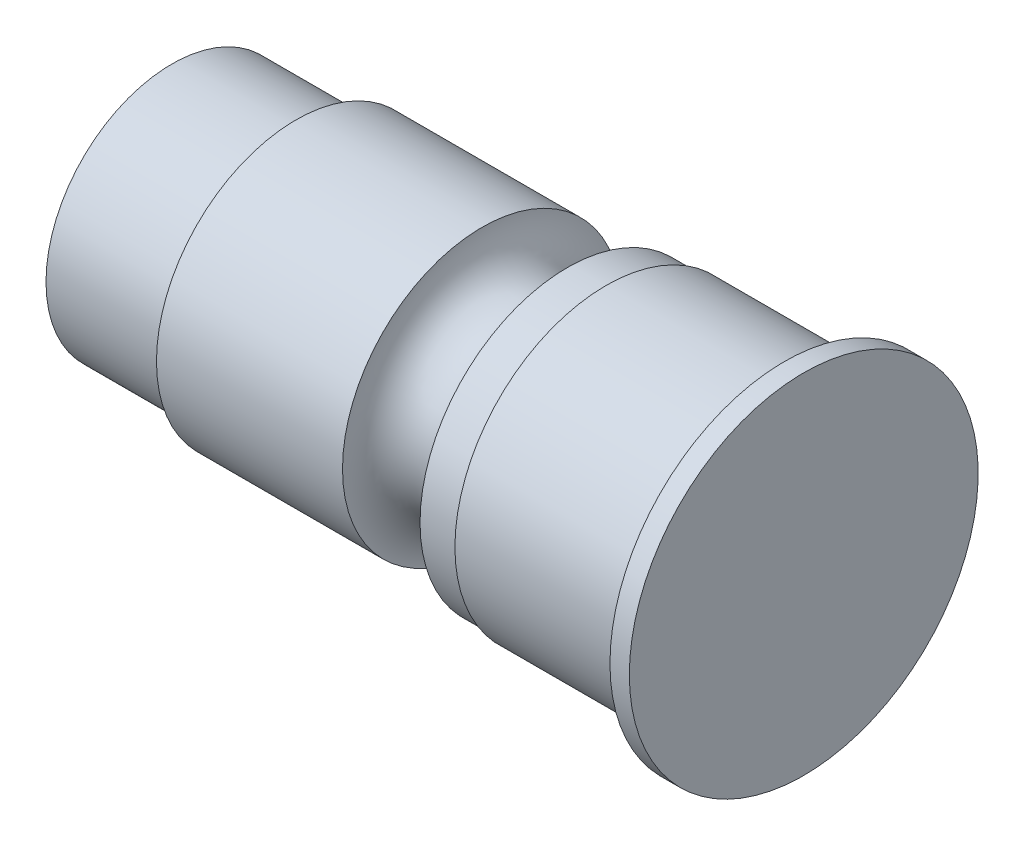
ISO-10303-21;
HEADER;
FILE_DESCRIPTION(('STEP AP214'),'2;1');
FILE_NAME('part.step','',(''),(''),'','','');
FILE_SCHEMA(('AUTOMOTIVE_DESIGN { 1 0 10303 214 1 1 1 1 }'));
ENDSEC;
DATA;
#1=APPLICATION_CONTEXT('core data for automotive mechanical design processes');
#2=APPLICATION_PROTOCOL_DEFINITION('international standard','automotive_design',2000,#1);
#3=PRODUCT_CONTEXT('',#1,'mechanical');
#4=PRODUCT('Part','Part','',(#3));
#5=PRODUCT_RELATED_PRODUCT_CATEGORY('part','',(#4));
#6=PRODUCT_DEFINITION_FORMATION('','',#4);
#7=PRODUCT_DEFINITION_CONTEXT('part definition',#1,'design');
#8=PRODUCT_DEFINITION('design','',#6,#7);
#9=PRODUCT_DEFINITION_SHAPE('','',#8);
#10=(LENGTH_UNIT() NAMED_UNIT(*) SI_UNIT(.MILLI.,.METRE.));
#11=(NAMED_UNIT(*) PLANE_ANGLE_UNIT() SI_UNIT($,.RADIAN.));
#12=(NAMED_UNIT(*) SI_UNIT($,.STERADIAN.) SOLID_ANGLE_UNIT());
#13=UNCERTAINTY_MEASURE_WITH_UNIT(LENGTH_MEASURE(1.E-05),#10,'distance_accuracy_value','');
#14=(GEOMETRIC_REPRESENTATION_CONTEXT(3) GLOBAL_UNCERTAINTY_ASSIGNED_CONTEXT((#13)) GLOBAL_UNIT_ASSIGNED_CONTEXT((#10,
#11,#12)) REPRESENTATION_CONTEXT('',''));
#15=CARTESIAN_POINT('',(0.,0.,0.));
#16=DIRECTION('',(0.,0.,1.));
#17=DIRECTION('',(1.,0.,0.));
#18=AXIS2_PLACEMENT_3D('',#15,#16,#17);
#19=CARTESIAN_POINT('',(-163.,0.,32.5));
#20=DIRECTION('',(-1.,0.,0.));
#21=DIRECTION('',(0.,0.,1.));
#22=AXIS2_PLACEMENT_3D('',#19,#20,#21);
#23=PLANE('',#22);
#24=CARTESIAN_POINT('',(-163.,0.,0.));
#25=DIRECTION('',(-1.,0.,0.));
#26=DIRECTION('',(0.,0.,1.));
#27=AXIS2_PLACEMENT_3D('',#24,#25,#26);
#28=CIRCLE('',#27,32.5);
#29=CARTESIAN_POINT('',(-163.,0.,32.5));
#30=VERTEX_POINT('',#29);
#31=EDGE_CURVE('E10',#30,#30,#28,.T.);
#32=ORIENTED_EDGE('',*,*,#31,.T.);
#33=EDGE_LOOP('',(#32));
#34=FACE_BOUND('',#33,.T.);
#35=ADVANCED_FACE('F43',(#34),#23,.T.);
#36=CARTESIAN_POINT('',(-163.,0.,0.));
#37=DIRECTION('',(-1.,0.,0.));
#38=DIRECTION('',(0.,0.,1.));
#39=AXIS2_PLACEMENT_3D('',#36,#37,#38);
#40=CYLINDRICAL_SURFACE('',#39,32.5);
#41=CARTESIAN_POINT('',(-131.,0.,0.));
#42=DIRECTION('',(-1.,0.,0.));
#43=DIRECTION('',(0.,0.,1.));
#44=AXIS2_PLACEMENT_3D('',#41,#42,#43);
#45=CIRCLE('',#44,32.5);
#46=CARTESIAN_POINT('',(-131.,0.,32.5));
#47=VERTEX_POINT('',#46);
#48=EDGE_CURVE('E50',#47,#47,#45,.T.);
#49=ORIENTED_EDGE('',*,*,#48,.T.);
#50=EDGE_LOOP('',(#49));
#51=FACE_BOUND('',#50,.T.);
#52=ORIENTED_EDGE('',*,*,#31,.F.);
#53=EDGE_LOOP('',(#52));
#54=FACE_BOUND('',#53,.T.);
#55=ADVANCED_FACE('F107',(#51,#54),#40,.T.);
#56=CARTESIAN_POINT('',(-131.,0.,36.));
#57=DIRECTION('',(-1.,0.,0.));
#58=DIRECTION('',(0.,0.,1.));
#59=AXIS2_PLACEMENT_3D('',#56,#57,#58);
#60=PLANE('',#59);
#61=CARTESIAN_POINT('',(-131.,0.,0.));
#62=DIRECTION('',(-1.,0.,0.));
#63=DIRECTION('',(0.,0.,1.));
#64=AXIS2_PLACEMENT_3D('',#61,#62,#63);
#65=CIRCLE('',#64,36.);
#66=CARTESIAN_POINT('',(-131.,0.,36.));
#67=VERTEX_POINT('',#66);
#68=EDGE_CURVE('E55',#67,#67,#65,.T.);
#69=ORIENTED_EDGE('',*,*,#68,.T.);
#70=EDGE_LOOP('',(#69));
#71=FACE_BOUND('',#70,.T.);
#72=ORIENTED_EDGE('',*,*,#48,.F.);
#73=EDGE_LOOP('',(#72));
#74=FACE_BOUND('',#73,.T.);
#75=ADVANCED_FACE('F111',(#71,#74),#60,.T.);
#76=CARTESIAN_POINT('',(-163.,0.,0.));
#77=DIRECTION('',(-1.,0.,0.));
#78=DIRECTION('',(0.,0.,1.));
#79=AXIS2_PLACEMENT_3D('',#76,#77,#78);
#80=CYLINDRICAL_SURFACE('',#79,36.);
#81=CARTESIAN_POINT('',(-83.,0.,0.));
#82=DIRECTION('',(-1.,0.,0.));
#83=DIRECTION('',(0.,0.,1.));
#84=AXIS2_PLACEMENT_3D('',#81,#82,#83);
#85=CIRCLE('',#84,36.);
#86=CARTESIAN_POINT('',(-83.,0.,36.));
#87=VERTEX_POINT('',#86);
#88=EDGE_CURVE('E60',#87,#87,#85,.T.);
#89=ORIENTED_EDGE('',*,*,#88,.T.);
#90=EDGE_LOOP('',(#89));
#91=FACE_BOUND('',#90,.T.);
#92=ORIENTED_EDGE('',*,*,#68,.F.);
#93=EDGE_LOOP('',(#92));
#94=FACE_BOUND('',#93,.T.);
#95=ADVANCED_FACE('F115',(#91,#94),#80,.T.);
#96=CARTESIAN_POINT('',(-72.,0.,0.));
#97=DIRECTION('',(-1.,0.,0.));
#98=DIRECTION('',(0.,0.,1.));
#99=AXIS2_PLACEMENT_3D('',#96,#97,#98);
#100=TOROIDAL_SURFACE('',#99,36.,11.);
#101=CARTESIAN_POINT('',(-61.,0.,0.));
#102=DIRECTION('',(-1.,0.,0.));
#103=DIRECTION('',(0.,0.,1.));
#104=AXIS2_PLACEMENT_3D('',#101,#102,#103);
#105=CIRCLE('',#104,36.);
#106=CARTESIAN_POINT('',(-61.,0.,36.));
#107=VERTEX_POINT('',#106);
#108=EDGE_CURVE('E66',#107,#107,#105,.T.);
#109=ORIENTED_EDGE('',*,*,#108,.T.);
#110=EDGE_LOOP('',(#109));
#111=FACE_BOUND('',#110,.T.);
#112=ORIENTED_EDGE('',*,*,#88,.F.);
#113=EDGE_LOOP('',(#112));
#114=FACE_BOUND('',#113,.T.);
#115=ADVANCED_FACE('F122',(#111,#114),#100,.F.);
#116=CARTESIAN_POINT('',(-61.,0.,38.));
#117=DIRECTION('',(-1.,0.,0.));
#118=DIRECTION('',(0.,0.,1.));
#119=AXIS2_PLACEMENT_3D('',#116,#117,#118);
#120=PLANE('',#119);
#121=CARTESIAN_POINT('',(-61.,0.,0.));
#122=DIRECTION('',(-1.,0.,0.));
#123=DIRECTION('',(0.,0.,1.));
#124=AXIS2_PLACEMENT_3D('',#121,#122,#123);
#125=CIRCLE('',#124,38.);
#126=CARTESIAN_POINT('',(-61.,0.,38.));
#127=VERTEX_POINT('',#126);
#128=EDGE_CURVE('E70',#127,#127,#125,.T.);
#129=ORIENTED_EDGE('',*,*,#128,.T.);
#130=EDGE_LOOP('',(#129));
#131=FACE_BOUND('',#130,.T.);
#132=ORIENTED_EDGE('',*,*,#108,.F.);
#133=EDGE_LOOP('',(#132));
#134=FACE_BOUND('',#133,.T.);
#135=ADVANCED_FACE('F126',(#131,#134),#120,.T.);
#136=CARTESIAN_POINT('',(-163.,0.,0.));
#137=DIRECTION('',(-1.,0.,0.));
#138=DIRECTION('',(0.,0.,1.));
#139=AXIS2_PLACEMENT_3D('',#136,#137,#138);
#140=CYLINDRICAL_SURFACE('',#139,38.);
#141=CARTESIAN_POINT('',(-51.,0.,0.));
#142=DIRECTION('',(-1.,0.,0.));
#143=DIRECTION('',(0.,0.,1.));
#144=AXIS2_PLACEMENT_3D('',#141,#142,#143);
#145=CIRCLE('',#144,38.);
#146=CARTESIAN_POINT('',(-51.,0.,38.));
#147=VERTEX_POINT('',#146);
#148=EDGE_CURVE('E74',#147,#147,#145,.T.);
#149=ORIENTED_EDGE('',*,*,#148,.T.);
#150=EDGE_LOOP('',(#149));
#151=FACE_BOUND('',#150,.T.);
#152=ORIENTED_EDGE('',*,*,#128,.F.);
#153=EDGE_LOOP('',(#152));
#154=FACE_BOUND('',#153,.T.);
#155=ADVANCED_FACE('F130',(#151,#154),#140,.T.);
#156=CARTESIAN_POINT('',(-51.,0.,39.));
#157=DIRECTION('',(-1.,0.,0.));
#158=DIRECTION('',(0.,0.,1.));
#159=AXIS2_PLACEMENT_3D('',#156,#157,#158);
#160=PLANE('',#159);
#161=CARTESIAN_POINT('',(-51.,0.,0.));
#162=DIRECTION('',(-1.,0.,0.));
#163=DIRECTION('',(0.,0.,1.));
#164=AXIS2_PLACEMENT_3D('',#161,#162,#163);
#165=CIRCLE('',#164,39.);
#166=CARTESIAN_POINT('',(-51.,0.,39.));
#167=VERTEX_POINT('',#166);
#168=EDGE_CURVE('E78',#167,#167,#165,.T.);
#169=ORIENTED_EDGE('',*,*,#168,.T.);
#170=EDGE_LOOP('',(#169));
#171=FACE_BOUND('',#170,.T.);
#172=ORIENTED_EDGE('',*,*,#148,.F.);
#173=EDGE_LOOP('',(#172));
#174=FACE_BOUND('',#173,.T.);
#175=ADVANCED_FACE('F134',(#171,#174),#160,.T.);
#176=CARTESIAN_POINT('',(-163.,0.,0.));
#177=DIRECTION('',(-1.,0.,0.));
#178=DIRECTION('',(0.,0.,1.));
#179=AXIS2_PLACEMENT_3D('',#176,#177,#178);
#180=CYLINDRICAL_SURFACE('',#179,39.);
#181=CARTESIAN_POINT('',(-5.,0.,0.));
#182=DIRECTION('',(-1.,0.,0.));
#183=DIRECTION('',(0.,0.,1.));
#184=AXIS2_PLACEMENT_3D('',#181,#182,#183);
#185=CIRCLE('',#184,39.);
#186=CARTESIAN_POINT('',(-5.,0.,39.));
#187=VERTEX_POINT('',#186);
#188=EDGE_CURVE('E82',#187,#187,#185,.T.);
#189=ORIENTED_EDGE('',*,*,#188,.T.);
#190=EDGE_LOOP('',(#189));
#191=FACE_BOUND('',#190,.T.);
#192=ORIENTED_EDGE('',*,*,#168,.F.);
#193=EDGE_LOOP('',(#192));
#194=FACE_BOUND('',#193,.T.);
#195=ADVANCED_FACE('F138',(#191,#194),#180,.T.);
#196=CARTESIAN_POINT('',(-5.,0.,45.));
#197=DIRECTION('',(-1.,0.,0.));
#198=DIRECTION('',(0.,0.,1.));
#199=AXIS2_PLACEMENT_3D('',#196,#197,#198);
#200=PLANE('',#199);
#201=CARTESIAN_POINT('',(-5.,0.,0.));
#202=DIRECTION('',(-1.,0.,0.));
#203=DIRECTION('',(0.,0.,1.));
#204=AXIS2_PLACEMENT_3D('',#201,#202,#203);
#205=CIRCLE('',#204,45.);
#206=CARTESIAN_POINT('',(-5.,0.,45.));
#207=VERTEX_POINT('',#206);
#208=EDGE_CURVE('E86',#207,#207,#205,.T.);
#209=ORIENTED_EDGE('',*,*,#208,.T.);
#210=EDGE_LOOP('',(#209));
#211=FACE_BOUND('',#210,.T.);
#212=ORIENTED_EDGE('',*,*,#188,.F.);
#213=EDGE_LOOP('',(#212));
#214=FACE_BOUND('',#213,.T.);
#215=ADVANCED_FACE('F104',(#211,#214),#200,.T.);
#216=CARTESIAN_POINT('',(-163.,0.,0.));
#217=DIRECTION('',(-1.,0.,0.));
#218=DIRECTION('',(0.,0.,1.));
#219=AXIS2_PLACEMENT_3D('',#216,#217,#218);
#220=CYLINDRICAL_SURFACE('',#219,45.);
#221=CARTESIAN_POINT('',(0.,0.,0.));
#222=DIRECTION('',(-1.,0.,0.));
#223=DIRECTION('',(0.,0.,1.));
#224=AXIS2_PLACEMENT_3D('',#221,#222,#223);
#225=CIRCLE('',#224,45.);
#226=CARTESIAN_POINT('',(0.,0.,45.));
#227=VERTEX_POINT('',#226);
#228=EDGE_CURVE('E90',#227,#227,#225,.T.);
#229=ORIENTED_EDGE('',*,*,#228,.T.);
#230=EDGE_LOOP('',(#229));
#231=FACE_BOUND('',#230,.T.);
#232=ORIENTED_EDGE('',*,*,#208,.F.);
#233=EDGE_LOOP('',(#232));
#234=FACE_BOUND('',#233,.T.);
#235=ADVANCED_FACE('F95',(#231,#234),#220,.T.);
#236=CARTESIAN_POINT('',(0.,0.,0.));
#237=DIRECTION('',(1.,0.,0.));
#238=DIRECTION('',(0.,0.,-1.));
#239=AXIS2_PLACEMENT_3D('',#236,#237,#238);
#240=PLANE('',#239);
#241=ORIENTED_EDGE('',*,*,#228,.F.);
#242=EDGE_LOOP('',(#241));
#243=FACE_BOUND('',#242,.T.);
#244=ADVANCED_FACE('F98',(#243),#240,.T.);
#245=CLOSED_SHELL('',(#35,#55,#75,#95,#115,#135,#155,#175,#195,#215,#235,#244));
#246=MANIFOLD_SOLID_BREP('B2',#245);
#247=ADVANCED_BREP_SHAPE_REPRESENTATION('',(#18,#246),#14);
#248=SHAPE_DEFINITION_REPRESENTATION(#9,#247);
ENDSEC;
END-ISO-10303-21;
